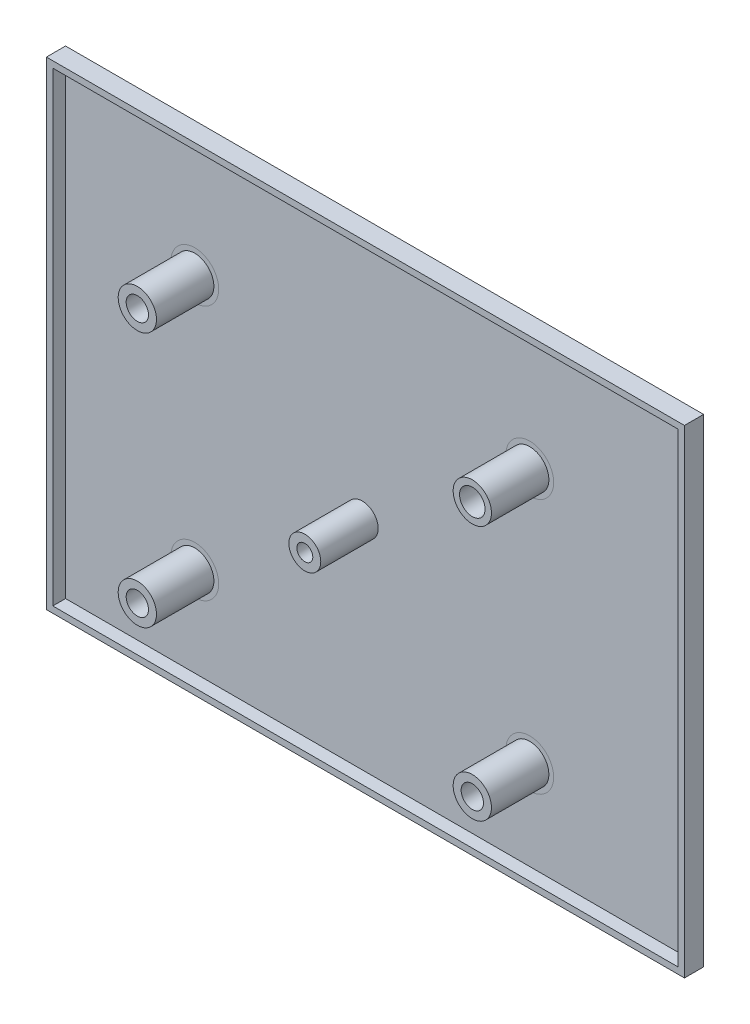
ISO-10303-21;
HEADER;
FILE_DESCRIPTION(('STEP AP214'),'2;1');
FILE_NAME('part.step','',(''),(''),'','','');
FILE_SCHEMA(('AUTOMOTIVE_DESIGN { 1 0 10303 214 1 1 1 1 }'));
ENDSEC;
DATA;
#1=APPLICATION_CONTEXT('core data for automotive mechanical design processes');
#2=APPLICATION_PROTOCOL_DEFINITION('international standard','automotive_design',2000,#1);
#3=PRODUCT_CONTEXT('',#1,'mechanical');
#4=PRODUCT('Part','Part','',(#3));
#5=PRODUCT_RELATED_PRODUCT_CATEGORY('part','',(#4));
#6=PRODUCT_DEFINITION_FORMATION('','',#4);
#7=PRODUCT_DEFINITION_CONTEXT('part definition',#1,'design');
#8=PRODUCT_DEFINITION('design','',#6,#7);
#9=PRODUCT_DEFINITION_SHAPE('','',#8);
#10=(LENGTH_UNIT() NAMED_UNIT(*) SI_UNIT(.MILLI.,.METRE.));
#11=(NAMED_UNIT(*) PLANE_ANGLE_UNIT() SI_UNIT($,.RADIAN.));
#12=(NAMED_UNIT(*) SI_UNIT($,.STERADIAN.) SOLID_ANGLE_UNIT());
#13=UNCERTAINTY_MEASURE_WITH_UNIT(LENGTH_MEASURE(1.E-05),#10,'distance_accuracy_value','');
#14=(GEOMETRIC_REPRESENTATION_CONTEXT(3) GLOBAL_UNCERTAINTY_ASSIGNED_CONTEXT((#13)) GLOBAL_UNIT_ASSIGNED_CONTEXT((#10,
#11,#12)) REPRESENTATION_CONTEXT('',''));
#15=CARTESIAN_POINT('',(0.,0.,0.));
#16=DIRECTION('',(0.,0.,1.));
#17=DIRECTION('',(1.,0.,0.));
#18=AXIS2_PLACEMENT_3D('',#15,#16,#17);
#19=CARTESIAN_POINT('',(0.,0.,2.));
#20=DIRECTION('',(0.,0.,-1.));
#21=DIRECTION('',(-1.,0.,0.));
#22=AXIS2_PLACEMENT_3D('',#19,#20,#21);
#23=PLANE('',#22);
#24=CARTESIAN_POINT('',(147.5,-120.,2.));
#25=DIRECTION('',(0.,0.,-1.));
#26=DIRECTION('',(-1.,0.,0.));
#27=AXIS2_PLACEMENT_3D('',#24,#25,#26);
#28=CIRCLE('',#27,7.50000000000001);
#29=CARTESIAN_POINT('',(140.,-120.,2.));
#30=VERTEX_POINT('',#29);
#31=EDGE_CURVE('E66',#30,#30,#28,.F.);
#32=ORIENTED_EDGE('',*,*,#31,.F.);
#33=EDGE_LOOP('',(#32));
#34=FACE_BOUND('',#33,.T.);
#35=CARTESIAN_POINT('',(42.5,-40.,2.));
#36=DIRECTION('',(0.,0.,-1.));
#37=DIRECTION('',(-1.,0.,0.));
#38=AXIS2_PLACEMENT_3D('',#35,#36,#37);
#39=CIRCLE('',#38,7.50000000000001);
#40=CARTESIAN_POINT('',(35.,-40.,2.));
#41=VERTEX_POINT('',#40);
#42=EDGE_CURVE('E187',#41,#41,#39,.F.);
#43=ORIENTED_EDGE('',*,*,#42,.F.);
#44=EDGE_LOOP('',(#43));
#45=FACE_BOUND('',#44,.T.);
#46=DIRECTION('',(0.,-1.,0.));
#47=VECTOR('',#46,1.);
#48=CARTESIAN_POINT('',(2.,-2.,2.));
#49=LINE('',#48,#47);
#50=CARTESIAN_POINT('',(2.,-2.,2.));
#51=VERTEX_POINT('',#50);
#52=CARTESIAN_POINT('',(2.,-148.,2.));
#53=VERTEX_POINT('',#52);
#54=EDGE_CURVE('E134',#51,#53,#49,.T.);
#55=ORIENTED_EDGE('',*,*,#54,.T.);
#56=DIRECTION('',(1.,0.,0.));
#57=VECTOR('',#56,1.);
#58=CARTESIAN_POINT('',(2.,-148.,2.));
#59=LINE('',#58,#57);
#60=CARTESIAN_POINT('',(198.,-148.,2.));
#61=VERTEX_POINT('',#60);
#62=EDGE_CURVE('E154',#53,#61,#59,.T.);
#63=ORIENTED_EDGE('',*,*,#62,.T.);
#64=DIRECTION('',(0.,1.,0.));
#65=VECTOR('',#64,1.);
#66=CARTESIAN_POINT('',(198.,-148.,2.));
#67=LINE('',#66,#65);
#68=CARTESIAN_POINT('',(198.,-2.,2.));
#69=VERTEX_POINT('',#68);
#70=EDGE_CURVE('E140',#61,#69,#67,.T.);
#71=ORIENTED_EDGE('',*,*,#70,.T.);
#72=DIRECTION('',(-1.,0.,0.));
#73=VECTOR('',#72,1.);
#74=CARTESIAN_POINT('',(198.,-2.,2.));
#75=LINE('',#74,#73);
#76=EDGE_CURVE('E158',#69,#51,#75,.T.);
#77=ORIENTED_EDGE('',*,*,#76,.T.);
#78=EDGE_LOOP('',(#55,#63,#71,#77));
#79=FACE_BOUND('',#78,.T.);
#80=CARTESIAN_POINT('',(95.,-80.,2.));
#81=DIRECTION('',(0.,0.,-1.));
#82=DIRECTION('',(-1.,0.,0.));
#83=AXIS2_PLACEMENT_3D('',#80,#81,#82);
#84=CIRCLE('',#83,5.00000000000001);
#85=CARTESIAN_POINT('',(90.,-80.,2.));
#86=VERTEX_POINT('',#85);
#87=EDGE_CURVE('E196',#86,#86,#84,.F.);
#88=ORIENTED_EDGE('',*,*,#87,.F.);
#89=EDGE_LOOP('',(#88));
#90=FACE_BOUND('',#89,.T.);
#91=CARTESIAN_POINT('',(147.5,-40.,2.));
#92=DIRECTION('',(0.,0.,-1.));
#93=DIRECTION('',(-1.,0.,0.));
#94=AXIS2_PLACEMENT_3D('',#91,#92,#93);
#95=CIRCLE('',#94,7.50000000000001);
#96=CARTESIAN_POINT('',(140.,-40.,2.));
#97=VERTEX_POINT('',#96);
#98=EDGE_CURVE('E248',#97,#97,#95,.F.);
#99=ORIENTED_EDGE('',*,*,#98,.F.);
#100=EDGE_LOOP('',(#99));
#101=FACE_BOUND('',#100,.T.);
#102=CARTESIAN_POINT('',(42.5,-120.,2.));
#103=DIRECTION('',(0.,0.,-1.));
#104=DIRECTION('',(-1.,0.,0.));
#105=AXIS2_PLACEMENT_3D('',#102,#103,#104);
#106=CIRCLE('',#105,7.50000000000001);
#107=CARTESIAN_POINT('',(35.,-120.,2.));
#108=VERTEX_POINT('',#107);
#109=EDGE_CURVE('E12',#108,#108,#106,.F.);
#110=ORIENTED_EDGE('',*,*,#109,.F.);
#111=EDGE_LOOP('',(#110));
#112=FACE_BOUND('',#111,.T.);
#113=ADVANCED_FACE('F57',(#34,#45,#79,#90,#101,#112),#23,.F.);
#114=ORIENTED_EDGE('',*,*,#109,.T.);
#115=EDGE_LOOP('',(#114));
#116=FACE_BOUND('',#115,.T.);
#117=CARTESIAN_POINT('',(42.5,-120.,2.));
#118=DIRECTION('',(0.,0.,-1.));
#119=DIRECTION('',(-1.,0.,0.));
#120=AXIS2_PLACEMENT_3D('',#117,#118,#119);
#121=CIRCLE('',#120,6.00000000000001);
#122=CARTESIAN_POINT('',(36.5,-120.,2.));
#123=VERTEX_POINT('',#122);
#124=EDGE_CURVE('E188',#123,#123,#121,.F.);
#125=ORIENTED_EDGE('',*,*,#124,.F.);
#126=EDGE_LOOP('',(#125));
#127=FACE_BOUND('',#126,.T.);
#128=ADVANCED_FACE('F262',(#116,#127),#23,.F.);
#129=ORIENTED_EDGE('',*,*,#31,.T.);
#130=EDGE_LOOP('',(#129));
#131=FACE_BOUND('',#130,.T.);
#132=CARTESIAN_POINT('',(147.5,-120.,2.));
#133=DIRECTION('',(0.,0.,-1.));
#134=DIRECTION('',(-1.,0.,0.));
#135=AXIS2_PLACEMENT_3D('',#132,#133,#134);
#136=CIRCLE('',#135,6.00000000000002);
#137=CARTESIAN_POINT('',(141.5,-120.,2.));
#138=VERTEX_POINT('',#137);
#139=EDGE_CURVE('E183',#138,#138,#136,.F.);
#140=ORIENTED_EDGE('',*,*,#139,.F.);
#141=EDGE_LOOP('',(#140));
#142=FACE_BOUND('',#141,.T.);
#143=ADVANCED_FACE('F257',(#131,#142),#23,.F.);
#144=ORIENTED_EDGE('',*,*,#98,.T.);
#145=EDGE_LOOP('',(#144));
#146=FACE_BOUND('',#145,.T.);
#147=CARTESIAN_POINT('',(147.5,-40.,2.));
#148=DIRECTION('',(0.,0.,-1.));
#149=DIRECTION('',(-1.,0.,0.));
#150=AXIS2_PLACEMENT_3D('',#147,#148,#149);
#151=CIRCLE('',#150,6.00000000000002);
#152=CARTESIAN_POINT('',(141.5,-40.,2.));
#153=VERTEX_POINT('',#152);
#154=EDGE_CURVE('E204',#153,#153,#151,.F.);
#155=ORIENTED_EDGE('',*,*,#154,.F.);
#156=EDGE_LOOP('',(#155));
#157=FACE_BOUND('',#156,.T.);
#158=ADVANCED_FACE('F319',(#146,#157),#23,.F.);
#159=ORIENTED_EDGE('',*,*,#42,.T.);
#160=EDGE_LOOP('',(#159));
#161=FACE_BOUND('',#160,.T.);
#162=CARTESIAN_POINT('',(42.5,-40.,2.));
#163=DIRECTION('',(0.,0.,-1.));
#164=DIRECTION('',(-1.,0.,0.));
#165=AXIS2_PLACEMENT_3D('',#162,#163,#164);
#166=CIRCLE('',#165,6.00000000000001);
#167=CARTESIAN_POINT('',(36.5,-40.,2.));
#168=VERTEX_POINT('',#167);
#169=EDGE_CURVE('E212',#168,#168,#166,.F.);
#170=ORIENTED_EDGE('',*,*,#169,.F.);
#171=EDGE_LOOP('',(#170));
#172=FACE_BOUND('',#171,.T.);
#173=ADVANCED_FACE('F264',(#161,#172),#23,.F.);
#174=CARTESIAN_POINT('',(42.5,-40.,20.));
#175=DIRECTION('',(0.,0.,-1.));
#176=DIRECTION('',(-1.,0.,0.));
#177=AXIS2_PLACEMENT_3D('',#174,#175,#176);
#178=CYLINDRICAL_SURFACE('',#177,6.00000000000001);
#179=CARTESIAN_POINT('',(42.5,-40.,20.));
#180=DIRECTION('',(0.,0.,1.));
#181=DIRECTION('',(1.,0.,0.));
#182=AXIS2_PLACEMENT_3D('',#179,#180,#181);
#183=CIRCLE('',#182,6.00000000000001);
#184=CARTESIAN_POINT('',(48.5,-40.,20.));
#185=VERTEX_POINT('',#184);
#186=EDGE_CURVE('E208',#185,#185,#183,.T.);
#187=ORIENTED_EDGE('',*,*,#186,.F.);
#188=EDGE_LOOP('',(#187));
#189=FACE_BOUND('',#188,.T.);
#190=ORIENTED_EDGE('',*,*,#169,.T.);
#191=EDGE_LOOP('',(#190));
#192=FACE_BOUND('',#191,.T.);
#193=ADVANCED_FACE('F313',(#189,#192),#178,.T.);
#194=CARTESIAN_POINT('',(42.5,-40.,20.));
#195=DIRECTION('',(0.,0.,1.));
#196=DIRECTION('',(1.,0.,0.));
#197=AXIS2_PLACEMENT_3D('',#194,#195,#196);
#198=PLANE('',#197);
#199=CARTESIAN_POINT('',(42.5,-40.,20.));
#200=DIRECTION('',(0.,0.,1.));
#201=DIRECTION('',(1.,0.,0.));
#202=AXIS2_PLACEMENT_3D('',#199,#200,#201);
#203=CIRCLE('',#202,3.5);
#204=CARTESIAN_POINT('',(46.,-40.,20.));
#205=VERTEX_POINT('',#204);
#206=EDGE_CURVE('E616',#205,#205,#203,.T.);
#207=ORIENTED_EDGE('',*,*,#206,.F.);
#208=EDGE_LOOP('',(#207));
#209=FACE_BOUND('',#208,.T.);
#210=ORIENTED_EDGE('',*,*,#186,.T.);
#211=EDGE_LOOP('',(#210));
#212=FACE_BOUND('',#211,.T.);
#213=ADVANCED_FACE('F306',(#209,#212),#198,.T.);
#214=CARTESIAN_POINT('',(147.5,-40.,20.));
#215=DIRECTION('',(0.,0.,-1.));
#216=DIRECTION('',(-1.,0.,0.));
#217=AXIS2_PLACEMENT_3D('',#214,#215,#216);
#218=CYLINDRICAL_SURFACE('',#217,6.00000000000002);
#219=CARTESIAN_POINT('',(147.5,-40.,20.));
#220=DIRECTION('',(0.,0.,1.));
#221=DIRECTION('',(1.,0.,0.));
#222=AXIS2_PLACEMENT_3D('',#219,#220,#221);
#223=CIRCLE('',#222,6.00000000000002);
#224=CARTESIAN_POINT('',(153.5,-40.,20.));
#225=VERTEX_POINT('',#224);
#226=EDGE_CURVE('E200',#225,#225,#223,.T.);
#227=ORIENTED_EDGE('',*,*,#226,.F.);
#228=EDGE_LOOP('',(#227));
#229=FACE_BOUND('',#228,.T.);
#230=ORIENTED_EDGE('',*,*,#154,.T.);
#231=EDGE_LOOP('',(#230));
#232=FACE_BOUND('',#231,.T.);
#233=ADVANCED_FACE('F303',(#229,#232),#218,.T.);
#234=CARTESIAN_POINT('',(147.5,-40.,20.));
#235=DIRECTION('',(0.,0.,1.));
#236=DIRECTION('',(1.,0.,0.));
#237=AXIS2_PLACEMENT_3D('',#234,#235,#236);
#238=PLANE('',#237);
#239=CARTESIAN_POINT('',(147.5,-40.,20.));
#240=DIRECTION('',(0.,0.,1.));
#241=DIRECTION('',(1.,0.,0.));
#242=AXIS2_PLACEMENT_3D('',#239,#240,#241);
#243=CIRCLE('',#242,3.99999999999999);
#244=CARTESIAN_POINT('',(151.5,-40.,20.));
#245=VERTEX_POINT('',#244);
#246=EDGE_CURVE('E622',#245,#245,#243,.T.);
#247=ORIENTED_EDGE('',*,*,#246,.F.);
#248=EDGE_LOOP('',(#247));
#249=FACE_BOUND('',#248,.T.);
#250=ORIENTED_EDGE('',*,*,#226,.T.);
#251=EDGE_LOOP('',(#250));
#252=FACE_BOUND('',#251,.T.);
#253=ADVANCED_FACE('F300',(#249,#252),#238,.T.);
#254=CARTESIAN_POINT('',(95.,-80.,20.));
#255=DIRECTION('',(0.,0.,-1.));
#256=DIRECTION('',(-1.,0.,0.));
#257=AXIS2_PLACEMENT_3D('',#254,#255,#256);
#258=CYLINDRICAL_SURFACE('',#257,5.00000000000001);
#259=CARTESIAN_POINT('',(95.,-80.,20.));
#260=DIRECTION('',(0.,0.,1.));
#261=DIRECTION('',(1.,0.,0.));
#262=AXIS2_PLACEMENT_3D('',#259,#260,#261);
#263=CIRCLE('',#262,5.00000000000001);
#264=CARTESIAN_POINT('',(100.,-80.,20.));
#265=VERTEX_POINT('',#264);
#266=EDGE_CURVE('E192',#265,#265,#263,.T.);
#267=ORIENTED_EDGE('',*,*,#266,.F.);
#268=EDGE_LOOP('',(#267));
#269=FACE_BOUND('',#268,.T.);
#270=ORIENTED_EDGE('',*,*,#87,.T.);
#271=EDGE_LOOP('',(#270));
#272=FACE_BOUND('',#271,.T.);
#273=ADVANCED_FACE('F291',(#269,#272),#258,.T.);
#274=CARTESIAN_POINT('',(95.,-80.,20.));
#275=DIRECTION('',(0.,0.,1.));
#276=DIRECTION('',(1.,0.,0.));
#277=AXIS2_PLACEMENT_3D('',#274,#275,#276);
#278=PLANE('',#277);
#279=CARTESIAN_POINT('',(95.,-80.,20.));
#280=DIRECTION('',(0.,0.,1.));
#281=DIRECTION('',(1.,0.,0.));
#282=AXIS2_PLACEMENT_3D('',#279,#280,#281);
#283=CIRCLE('',#282,2.50000000000001);
#284=CARTESIAN_POINT('',(97.5,-80.,20.));
#285=VERTEX_POINT('',#284);
#286=EDGE_CURVE('E642',#285,#285,#283,.T.);
#287=ORIENTED_EDGE('',*,*,#286,.F.);
#288=EDGE_LOOP('',(#287));
#289=FACE_BOUND('',#288,.T.);
#290=ORIENTED_EDGE('',*,*,#266,.T.);
#291=EDGE_LOOP('',(#290));
#292=FACE_BOUND('',#291,.T.);
#293=ADVANCED_FACE('F281',(#289,#292),#278,.T.);
#294=CARTESIAN_POINT('',(42.5,-120.,20.));
#295=DIRECTION('',(0.,0.,-1.));
#296=DIRECTION('',(-1.,0.,0.));
#297=AXIS2_PLACEMENT_3D('',#294,#295,#296);
#298=CYLINDRICAL_SURFACE('',#297,6.00000000000001);
#299=CARTESIAN_POINT('',(42.5,-120.,20.));
#300=DIRECTION('',(0.,0.,1.));
#301=DIRECTION('',(1.,0.,0.));
#302=AXIS2_PLACEMENT_3D('',#299,#300,#301);
#303=CIRCLE('',#302,6.00000000000001);
#304=CARTESIAN_POINT('',(48.5,-120.,20.));
#305=VERTEX_POINT('',#304);
#306=EDGE_CURVE('E182',#305,#305,#303,.T.);
#307=ORIENTED_EDGE('',*,*,#306,.F.);
#308=EDGE_LOOP('',(#307));
#309=FACE_BOUND('',#308,.T.);
#310=ORIENTED_EDGE('',*,*,#124,.T.);
#311=EDGE_LOOP('',(#310));
#312=FACE_BOUND('',#311,.T.);
#313=ADVANCED_FACE('F278',(#309,#312),#298,.T.);
#314=CARTESIAN_POINT('',(42.5,-120.,20.));
#315=DIRECTION('',(0.,0.,1.));
#316=DIRECTION('',(1.,0.,0.));
#317=AXIS2_PLACEMENT_3D('',#314,#315,#316);
#318=PLANE('',#317);
#319=CARTESIAN_POINT('',(42.5,-120.,20.));
#320=DIRECTION('',(0.,0.,1.));
#321=DIRECTION('',(1.,0.,0.));
#322=AXIS2_PLACEMENT_3D('',#319,#320,#321);
#323=CIRCLE('',#322,3.5);
#324=CARTESIAN_POINT('',(46.,-120.,20.));
#325=VERTEX_POINT('',#324);
#326=EDGE_CURVE('E601',#325,#325,#323,.T.);
#327=ORIENTED_EDGE('',*,*,#326,.F.);
#328=EDGE_LOOP('',(#327));
#329=FACE_BOUND('',#328,.T.);
#330=ORIENTED_EDGE('',*,*,#306,.T.);
#331=EDGE_LOOP('',(#330));
#332=FACE_BOUND('',#331,.T.);
#333=ADVANCED_FACE('F280',(#329,#332),#318,.T.);
#334=CARTESIAN_POINT('',(147.5,-120.,20.));
#335=DIRECTION('',(0.,0.,-1.));
#336=DIRECTION('',(-1.,0.,0.));
#337=AXIS2_PLACEMENT_3D('',#334,#335,#336);
#338=CYLINDRICAL_SURFACE('',#337,6.00000000000002);
#339=CARTESIAN_POINT('',(147.5,-120.,20.));
#340=DIRECTION('',(0.,0.,1.));
#341=DIRECTION('',(1.,0.,0.));
#342=AXIS2_PLACEMENT_3D('',#339,#340,#341);
#343=CIRCLE('',#342,6.00000000000002);
#344=CARTESIAN_POINT('',(153.5,-120.,20.));
#345=VERTEX_POINT('',#344);
#346=EDGE_CURVE('E178',#345,#345,#343,.T.);
#347=ORIENTED_EDGE('',*,*,#346,.F.);
#348=EDGE_LOOP('',(#347));
#349=FACE_BOUND('',#348,.T.);
#350=ORIENTED_EDGE('',*,*,#139,.T.);
#351=EDGE_LOOP('',(#350));
#352=FACE_BOUND('',#351,.T.);
#353=ADVANCED_FACE('F288',(#349,#352),#338,.T.);
#354=CARTESIAN_POINT('',(147.5,-120.,20.));
#355=DIRECTION('',(0.,0.,1.));
#356=DIRECTION('',(1.,0.,0.));
#357=AXIS2_PLACEMENT_3D('',#354,#355,#356);
#358=PLANE('',#357);
#359=CARTESIAN_POINT('',(147.5,-120.,20.));
#360=DIRECTION('',(0.,0.,1.));
#361=DIRECTION('',(1.,0.,0.));
#362=AXIS2_PLACEMENT_3D('',#359,#360,#361);
#363=CIRCLE('',#362,3.49999999999999);
#364=CARTESIAN_POINT('',(151.,-120.,20.));
#365=VERTEX_POINT('',#364);
#366=EDGE_CURVE('E605',#365,#365,#363,.T.);
#367=ORIENTED_EDGE('',*,*,#366,.F.);
#368=EDGE_LOOP('',(#367));
#369=FACE_BOUND('',#368,.T.);
#370=ORIENTED_EDGE('',*,*,#346,.T.);
#371=EDGE_LOOP('',(#370));
#372=FACE_BOUND('',#371,.T.);
#373=ADVANCED_FACE('F296',(#369,#372),#358,.T.);
#374=CARTESIAN_POINT('',(0.,0.,6.));
#375=DIRECTION('',(0.,0.,1.));
#376=DIRECTION('',(1.,0.,0.));
#377=AXIS2_PLACEMENT_3D('',#374,#375,#376);
#378=PLANE('',#377);
#379=DIRECTION('',(0.,1.,0.));
#380=VECTOR('',#379,1.);
#381=CARTESIAN_POINT('',(200.,-150.,6.));
#382=LINE('',#381,#380);
#383=CARTESIAN_POINT('',(200.,-150.,6.));
#384=VERTEX_POINT('',#383);
#385=CARTESIAN_POINT('',(200.,0.,6.));
#386=VERTEX_POINT('',#385);
#387=EDGE_CURVE('E141',#384,#386,#382,.T.);
#388=ORIENTED_EDGE('',*,*,#387,.T.);
#389=DIRECTION('',(-1.,0.,0.));
#390=VECTOR('',#389,1.);
#391=CARTESIAN_POINT('',(200.,0.,6.));
#392=LINE('',#391,#390);
#393=CARTESIAN_POINT('',(0.,0.,6.));
#394=VERTEX_POINT('',#393);
#395=EDGE_CURVE('E169',#386,#394,#392,.T.);
#396=ORIENTED_EDGE('',*,*,#395,.T.);
#397=DIRECTION('',(0.,-1.,0.));
#398=VECTOR('',#397,1.);
#399=CARTESIAN_POINT('',(0.,0.,6.));
#400=LINE('',#399,#398);
#401=CARTESIAN_POINT('',(0.,-150.,6.));
#402=VERTEX_POINT('',#401);
#403=EDGE_CURVE('E172',#394,#402,#400,.T.);
#404=ORIENTED_EDGE('',*,*,#403,.T.);
#405=DIRECTION('',(1.,0.,0.));
#406=VECTOR('',#405,1.);
#407=CARTESIAN_POINT('',(0.,-150.,6.));
#408=LINE('',#407,#406);
#409=EDGE_CURVE('E175',#402,#384,#408,.T.);
#410=ORIENTED_EDGE('',*,*,#409,.T.);
#411=EDGE_LOOP('',(#388,#396,#404,#410));
#412=FACE_BOUND('',#411,.T.);
#413=DIRECTION('',(0.,1.,0.));
#414=VECTOR('',#413,1.);
#415=CARTESIAN_POINT('',(198.,-148.,6.));
#416=LINE('',#415,#414);
#417=CARTESIAN_POINT('',(198.,-148.,6.));
#418=VERTEX_POINT('',#417);
#419=CARTESIAN_POINT('',(198.,-2.,6.));
#420=VERTEX_POINT('',#419);
#421=EDGE_CURVE('E133',#418,#420,#416,.T.);
#422=ORIENTED_EDGE('',*,*,#421,.F.);
#423=DIRECTION('',(1.,0.,0.));
#424=VECTOR('',#423,1.);
#425=CARTESIAN_POINT('',(2.,-148.,6.));
#426=LINE('',#425,#424);
#427=CARTESIAN_POINT('',(2.,-148.,6.));
#428=VERTEX_POINT('',#427);
#429=EDGE_CURVE('E125',#428,#418,#426,.T.);
#430=ORIENTED_EDGE('',*,*,#429,.F.);
#431=DIRECTION('',(0.,-1.,0.));
#432=VECTOR('',#431,1.);
#433=CARTESIAN_POINT('',(2.,-2.,6.));
#434=LINE('',#433,#432);
#435=CARTESIAN_POINT('',(2.,-2.,6.));
#436=VERTEX_POINT('',#435);
#437=EDGE_CURVE('E149',#436,#428,#434,.T.);
#438=ORIENTED_EDGE('',*,*,#437,.F.);
#439=DIRECTION('',(-1.,0.,0.));
#440=VECTOR('',#439,1.);
#441=CARTESIAN_POINT('',(198.,-2.,6.));
#442=LINE('',#441,#440);
#443=EDGE_CURVE('E147',#420,#436,#442,.T.);
#444=ORIENTED_EDGE('',*,*,#443,.F.);
#445=EDGE_LOOP('',(#422,#430,#438,#444));
#446=FACE_BOUND('',#445,.T.);
#447=ADVANCED_FACE('F145',(#412,#446),#378,.T.);
#448=CARTESIAN_POINT('',(2.,-148.,6.));
#449=DIRECTION('',(0.,1.,0.));
#450=DIRECTION('',(0.,0.,1.));
#451=AXIS2_PLACEMENT_3D('',#448,#449,#450);
#452=PLANE('',#451);
#453=ORIENTED_EDGE('',*,*,#62,.F.);
#454=DIRECTION('',(0.,0.,-1.));
#455=VECTOR('',#454,1.);
#456=CARTESIAN_POINT('',(2.,-148.,6.));
#457=LINE('',#456,#455);
#458=EDGE_CURVE('E73',#428,#53,#457,.T.);
#459=ORIENTED_EDGE('',*,*,#458,.F.);
#460=ORIENTED_EDGE('',*,*,#429,.T.);
#461=DIRECTION('',(0.,0.,-1.));
#462=VECTOR('',#461,1.);
#463=CARTESIAN_POINT('',(198.,-148.,6.));
#464=LINE('',#463,#462);
#465=EDGE_CURVE('E128',#418,#61,#464,.T.);
#466=ORIENTED_EDGE('',*,*,#465,.T.);
#467=EDGE_LOOP('',(#453,#459,#460,#466));
#468=FACE_BOUND('',#467,.T.);
#469=ADVANCED_FACE('F127',(#468),#452,.T.);
#470=CARTESIAN_POINT('',(198.,-148.,6.));
#471=DIRECTION('',(-1.,0.,0.));
#472=DIRECTION('',(0.,0.,1.));
#473=AXIS2_PLACEMENT_3D('',#470,#471,#472);
#474=PLANE('',#473);
#475=ORIENTED_EDGE('',*,*,#70,.F.);
#476=ORIENTED_EDGE('',*,*,#465,.F.);
#477=ORIENTED_EDGE('',*,*,#421,.T.);
#478=DIRECTION('',(0.,0.,-1.));
#479=VECTOR('',#478,1.);
#480=CARTESIAN_POINT('',(198.,-2.,6.));
#481=LINE('',#480,#479);
#482=EDGE_CURVE('E142',#420,#69,#481,.T.);
#483=ORIENTED_EDGE('',*,*,#482,.T.);
#484=EDGE_LOOP('',(#475,#476,#477,#483));
#485=FACE_BOUND('',#484,.T.);
#486=ADVANCED_FACE('F137',(#485),#474,.T.);
#487=CARTESIAN_POINT('',(198.,-2.,6.));
#488=DIRECTION('',(0.,-1.,0.));
#489=DIRECTION('',(0.,0.,-1.));
#490=AXIS2_PLACEMENT_3D('',#487,#488,#489);
#491=PLANE('',#490);
#492=ORIENTED_EDGE('',*,*,#76,.F.);
#493=ORIENTED_EDGE('',*,*,#482,.F.);
#494=ORIENTED_EDGE('',*,*,#443,.T.);
#495=DIRECTION('',(0.,0.,-1.));
#496=VECTOR('',#495,1.);
#497=CARTESIAN_POINT('',(2.,-2.,6.));
#498=LINE('',#497,#496);
#499=EDGE_CURVE('E164',#436,#51,#498,.T.);
#500=ORIENTED_EDGE('',*,*,#499,.T.);
#501=EDGE_LOOP('',(#492,#493,#494,#500));
#502=FACE_BOUND('',#501,.T.);
#503=ADVANCED_FACE('F498',(#502),#491,.T.);
#504=CARTESIAN_POINT('',(2.,-2.,6.));
#505=DIRECTION('',(1.,0.,0.));
#506=DIRECTION('',(0.,0.,-1.));
#507=AXIS2_PLACEMENT_3D('',#504,#505,#506);
#508=PLANE('',#507);
#509=ORIENTED_EDGE('',*,*,#54,.F.);
#510=ORIENTED_EDGE('',*,*,#499,.F.);
#511=ORIENTED_EDGE('',*,*,#437,.T.);
#512=ORIENTED_EDGE('',*,*,#458,.T.);
#513=EDGE_LOOP('',(#509,#510,#511,#512));
#514=FACE_BOUND('',#513,.T.);
#515=ADVANCED_FACE('F325',(#514),#508,.T.);
#516=CARTESIAN_POINT('',(0.,0.,0.));
#517=DIRECTION('',(0.,0.,-1.));
#518=DIRECTION('',(-1.,0.,0.));
#519=AXIS2_PLACEMENT_3D('',#516,#517,#518);
#520=PLANE('',#519);
#521=DIRECTION('',(0.,-1.,0.));
#522=VECTOR('',#521,1.);
#523=CARTESIAN_POINT('',(0.,-150.,0.));
#524=LINE('',#523,#522);
#525=CARTESIAN_POINT('',(0.,0.,0.));
#526=VERTEX_POINT('',#525);
#527=CARTESIAN_POINT('',(0.,-150.,0.));
#528=VERTEX_POINT('',#527);
#529=EDGE_CURVE('E216',#526,#528,#524,.T.);
#530=ORIENTED_EDGE('',*,*,#529,.F.);
#531=DIRECTION('',(-1.,0.,0.));
#532=VECTOR('',#531,1.);
#533=CARTESIAN_POINT('',(0.,0.,0.));
#534=LINE('',#533,#532);
#535=CARTESIAN_POINT('',(200.,0.,0.));
#536=VERTEX_POINT('',#535);
#537=EDGE_CURVE('E81',#536,#526,#534,.T.);
#538=ORIENTED_EDGE('',*,*,#537,.F.);
#539=DIRECTION('',(0.,1.,0.));
#540=VECTOR('',#539,1.);
#541=CARTESIAN_POINT('',(200.,0.,0.));
#542=LINE('',#541,#540);
#543=CARTESIAN_POINT('',(200.,-150.,0.));
#544=VERTEX_POINT('',#543);
#545=EDGE_CURVE('E227',#544,#536,#542,.T.);
#546=ORIENTED_EDGE('',*,*,#545,.F.);
#547=DIRECTION('',(1.,0.,0.));
#548=VECTOR('',#547,1.);
#549=CARTESIAN_POINT('',(200.,-150.,0.));
#550=LINE('',#549,#548);
#551=EDGE_CURVE('E224',#528,#544,#550,.T.);
#552=ORIENTED_EDGE('',*,*,#551,.F.);
#553=EDGE_LOOP('',(#530,#538,#546,#552));
#554=FACE_BOUND('',#553,.T.);
#555=ADVANCED_FACE('F321',(#554),#520,.T.);
#556=CARTESIAN_POINT('',(200.,-150.,2.));
#557=DIRECTION('',(0.,1.,0.));
#558=DIRECTION('',(-1.,0.,0.));
#559=AXIS2_PLACEMENT_3D('',#556,#557,#558);
#560=PLANE('',#559);
#561=ORIENTED_EDGE('',*,*,#551,.T.);
#562=DIRECTION('',(0.,0.,-1.));
#563=VECTOR('',#562,1.);
#564=CARTESIAN_POINT('',(200.,-150.,2.));
#565=LINE('',#564,#563);
#566=EDGE_CURVE('E238',#384,#544,#565,.T.);
#567=ORIENTED_EDGE('',*,*,#566,.F.);
#568=ORIENTED_EDGE('',*,*,#409,.F.);
#569=DIRECTION('',(0.,0.,-1.));
#570=VECTOR('',#569,1.);
#571=CARTESIAN_POINT('',(0.,-150.,2.));
#572=LINE('',#571,#570);
#573=EDGE_CURVE('E220',#402,#528,#572,.T.);
#574=ORIENTED_EDGE('',*,*,#573,.T.);
#575=EDGE_LOOP('',(#561,#567,#568,#574));
#576=FACE_BOUND('',#575,.T.);
#577=ADVANCED_FACE('F324',(#576),#560,.F.);
#578=CARTESIAN_POINT('',(0.,-150.,2.));
#579=DIRECTION('',(1.,0.,0.));
#580=DIRECTION('',(0.,0.,-1.));
#581=AXIS2_PLACEMENT_3D('',#578,#579,#580);
#582=PLANE('',#581);
#583=ORIENTED_EDGE('',*,*,#529,.T.);
#584=ORIENTED_EDGE('',*,*,#573,.F.);
#585=ORIENTED_EDGE('',*,*,#403,.F.);
#586=DIRECTION('',(0.,0.,-1.));
#587=VECTOR('',#586,1.);
#588=CARTESIAN_POINT('',(0.,0.,2.));
#589=LINE('',#588,#587);
#590=EDGE_CURVE('E232',#394,#526,#589,.T.);
#591=ORIENTED_EDGE('',*,*,#590,.T.);
#592=EDGE_LOOP('',(#583,#584,#585,#591));
#593=FACE_BOUND('',#592,.T.);
#594=ADVANCED_FACE('F59',(#593),#582,.F.);
#595=CARTESIAN_POINT('',(0.,0.,2.));
#596=DIRECTION('',(0.,-1.,0.));
#597=DIRECTION('',(0.,0.,-1.));
#598=AXIS2_PLACEMENT_3D('',#595,#596,#597);
#599=PLANE('',#598);
#600=ORIENTED_EDGE('',*,*,#537,.T.);
#601=ORIENTED_EDGE('',*,*,#590,.F.);
#602=ORIENTED_EDGE('',*,*,#395,.F.);
#603=DIRECTION('',(0.,0.,-1.));
#604=VECTOR('',#603,1.);
#605=CARTESIAN_POINT('',(200.,0.,2.));
#606=LINE('',#605,#604);
#607=EDGE_CURVE('E235',#386,#536,#606,.T.);
#608=ORIENTED_EDGE('',*,*,#607,.T.);
#609=EDGE_LOOP('',(#600,#601,#602,#608));
#610=FACE_BOUND('',#609,.T.);
#611=ADVANCED_FACE('F327',(#610),#599,.F.);
#612=CARTESIAN_POINT('',(200.,0.,2.));
#613=DIRECTION('',(-1.,0.,0.));
#614=DIRECTION('',(0.,-1.,0.));
#615=AXIS2_PLACEMENT_3D('',#612,#613,#614);
#616=PLANE('',#615);
#617=ORIENTED_EDGE('',*,*,#545,.T.);
#618=ORIENTED_EDGE('',*,*,#607,.F.);
#619=ORIENTED_EDGE('',*,*,#387,.F.);
#620=ORIENTED_EDGE('',*,*,#566,.T.);
#621=EDGE_LOOP('',(#617,#618,#619,#620));
#622=FACE_BOUND('',#621,.T.);
#623=ADVANCED_FACE('F330',(#622),#616,.F.);
#624=CARTESIAN_POINT('',(0.,0.,2.));
#625=DIRECTION('',(0.,0.,-1.));
#626=DIRECTION('',(-1.,0.,0.));
#627=AXIS2_PLACEMENT_3D('',#624,#625,#626);
#628=PLANE('',#627);
#629=CARTESIAN_POINT('',(147.5,-40.,2.));
#630=DIRECTION('',(0.,0.,-1.));
#631=DIRECTION('',(-1.,0.,0.));
#632=AXIS2_PLACEMENT_3D('',#629,#630,#631);
#633=CIRCLE('',#632,3.99999999999999);
#634=CARTESIAN_POINT('',(143.5,-40.,2.));
#635=VERTEX_POINT('',#634);
#636=EDGE_CURVE('E156',#635,#635,#633,.F.);
#637=ORIENTED_EDGE('',*,*,#636,.T.);
#638=EDGE_LOOP('',(#637));
#639=FACE_BOUND('',#638,.T.);
#640=ADVANCED_FACE('F332',(#639),#628,.F.);
#641=CARTESIAN_POINT('',(147.5,-40.,-9.31370849898475));
#642=DIRECTION('',(0.,0.,1.));
#643=DIRECTION('',(1.,0.,0.));
#644=AXIS2_PLACEMENT_3D('',#641,#642,#643);
#645=CYLINDRICAL_SURFACE('',#644,3.99999999999999);
#646=ORIENTED_EDGE('',*,*,#246,.T.);
#647=EDGE_LOOP('',(#646));
#648=FACE_BOUND('',#647,.T.);
#649=ORIENTED_EDGE('',*,*,#636,.F.);
#650=EDGE_LOOP('',(#649));
#651=FACE_BOUND('',#650,.T.);
#652=ADVANCED_FACE('F546',(#648,#651),#645,.F.);
#653=CARTESIAN_POINT('',(0.,0.,2.));
#654=DIRECTION('',(0.,0.,-1.));
#655=DIRECTION('',(-1.,0.,0.));
#656=AXIS2_PLACEMENT_3D('',#653,#654,#655);
#657=PLANE('',#656);
#658=CARTESIAN_POINT('',(42.5,-40.,2.));
#659=DIRECTION('',(0.,0.,-1.));
#660=DIRECTION('',(-1.,0.,0.));
#661=AXIS2_PLACEMENT_3D('',#658,#659,#660);
#662=CIRCLE('',#661,3.5);
#663=CARTESIAN_POINT('',(46.,-40.,2.));
#664=VERTEX_POINT('',#663);
#665=EDGE_CURVE('E619',#664,#664,#662,.F.);
#666=ORIENTED_EDGE('',*,*,#665,.T.);
#667=EDGE_LOOP('',(#666));
#668=FACE_BOUND('',#667,.T.);
#669=ADVANCED_FACE('F552',(#668),#657,.F.);
#670=CARTESIAN_POINT('',(42.5,-40.,-7.89949493661167));
#671=DIRECTION('',(0.,0.,1.));
#672=DIRECTION('',(1.,0.,0.));
#673=AXIS2_PLACEMENT_3D('',#670,#671,#672);
#674=CYLINDRICAL_SURFACE('',#673,3.5);
#675=CARTESIAN_POINT('',(46.,-40.,20.));
#676=CARTESIAN_POINT('',(46.,-40.,19.8125));
#677=CARTESIAN_POINT('',(46.,-40.,19.625));
#678=CARTESIAN_POINT('',(46.,-40.,19.25));
#679=CARTESIAN_POINT('',(46.,-40.,19.0625));
#680=CARTESIAN_POINT('',(46.,-40.,18.6875));
#681=CARTESIAN_POINT('',(46.,-40.,18.5));
#682=CARTESIAN_POINT('',(46.,-40.,18.125));
#683=CARTESIAN_POINT('',(46.,-40.,17.9375));
#684=CARTESIAN_POINT('',(46.,-40.,17.5625));
#685=CARTESIAN_POINT('',(46.,-40.,17.375));
#686=CARTESIAN_POINT('',(46.,-40.,17.));
#687=CARTESIAN_POINT('',(46.,-40.,16.8125));
#688=CARTESIAN_POINT('',(46.,-40.,16.4375));
#689=CARTESIAN_POINT('',(46.,-40.,16.25));
#690=CARTESIAN_POINT('',(46.,-40.,15.875));
#691=CARTESIAN_POINT('',(46.,-40.,15.6875));
#692=CARTESIAN_POINT('',(46.,-40.,15.3125));
#693=CARTESIAN_POINT('',(46.,-40.,15.125));
#694=CARTESIAN_POINT('',(46.,-40.,14.75));
#695=CARTESIAN_POINT('',(46.,-40.,14.5625));
#696=CARTESIAN_POINT('',(46.,-40.,14.1875));
#697=CARTESIAN_POINT('',(46.,-40.,14.));
#698=CARTESIAN_POINT('',(46.,-40.,13.625));
#699=CARTESIAN_POINT('',(46.,-40.,13.4375));
#700=CARTESIAN_POINT('',(46.,-40.,13.0625));
#701=CARTESIAN_POINT('',(46.,-40.,12.875));
#702=CARTESIAN_POINT('',(46.,-40.,12.5));
#703=CARTESIAN_POINT('',(46.,-40.,12.3125));
#704=CARTESIAN_POINT('',(46.,-40.,11.9375));
#705=CARTESIAN_POINT('',(46.,-40.,11.75));
#706=CARTESIAN_POINT('',(46.,-40.,11.375));
#707=CARTESIAN_POINT('',(46.,-40.,11.1875));
#708=CARTESIAN_POINT('',(46.,-40.,10.8125));
#709=CARTESIAN_POINT('',(46.,-40.,10.625));
#710=CARTESIAN_POINT('',(46.,-40.,10.25));
#711=CARTESIAN_POINT('',(46.,-40.,10.0625));
#712=CARTESIAN_POINT('',(46.,-40.,9.6875));
#713=CARTESIAN_POINT('',(46.,-40.,9.5));
#714=CARTESIAN_POINT('',(46.,-40.,9.125));
#715=CARTESIAN_POINT('',(46.,-40.,8.9375));
#716=CARTESIAN_POINT('',(46.,-40.,8.5625));
#717=CARTESIAN_POINT('',(46.,-40.,8.375));
#718=CARTESIAN_POINT('',(46.,-40.,8.));
#719=CARTESIAN_POINT('',(46.,-40.,7.8125));
#720=CARTESIAN_POINT('',(46.,-40.,7.4375));
#721=CARTESIAN_POINT('',(46.,-40.,7.25));
#722=CARTESIAN_POINT('',(46.,-40.,6.875));
#723=CARTESIAN_POINT('',(46.,-40.,6.6875));
#724=CARTESIAN_POINT('',(46.,-40.,6.3125));
#725=CARTESIAN_POINT('',(46.,-40.,6.125));
#726=CARTESIAN_POINT('',(46.,-40.,5.75));
#727=CARTESIAN_POINT('',(46.,-40.,5.5625));
#728=CARTESIAN_POINT('',(46.,-40.,5.1875));
#729=CARTESIAN_POINT('',(46.,-40.,5.));
#730=CARTESIAN_POINT('',(46.,-40.,4.625));
#731=CARTESIAN_POINT('',(46.,-40.,4.4375));
#732=CARTESIAN_POINT('',(46.,-40.,4.0625));
#733=CARTESIAN_POINT('',(46.,-40.,3.875));
#734=CARTESIAN_POINT('',(46.,-40.,3.5));
#735=CARTESIAN_POINT('',(46.,-40.,3.3125));
#736=CARTESIAN_POINT('',(46.,-40.,2.9375));
#737=CARTESIAN_POINT('',(46.,-40.,2.75));
#738=CARTESIAN_POINT('',(46.,-40.,2.375));
#739=CARTESIAN_POINT('',(46.,-40.,2.1875));
#740=CARTESIAN_POINT('',(46.,-40.,2.));
#741=B_SPLINE_CURVE_WITH_KNOTS('',3,(#675,#676,#677,#678,#679,#680,#681,#682,#683,#684,#685,
#686,#687,#688,#689,#690,#691,#692,#693,#694,#695,#696,#697,#698,#699,#700,#701,#702,#703,#704,
#705,#706,#707,#708,#709,#710,#711,#712,#713,#714,#715,#716,#717,#718,#719,#720,#721,#722,#723,
#724,#725,#726,#727,#728,#729,#730,#731,#732,#733,#734,#735,#736,#737,#738,#739,#740),
.UNSPECIFIED.,.F.,.F.,(4,2,2,2,2,2,2,2,2,2,2,2,2,2,2,2,2,2,2,2,2,2,2,2,2,2,2,2,2,2,2,2,4),(0.,
0.5625,1.125,1.6875,2.25,2.8125,3.375,3.9375,4.5,5.0625,5.625,6.1875,6.75,7.3125,7.875,8.4375,
9.,9.5625,10.125,10.6875,11.25,11.8125,12.375,12.9375,13.5,14.0625,14.625,15.1875,15.75,16.3125,
16.875,17.4375,18.),.UNSPECIFIED.);
#742=EDGE_CURVE('BSEAM559',#205,#664,#741,.T.);
#743=ORIENTED_EDGE('',*,*,#206,.T.);
#744=ORIENTED_EDGE('',*,*,#665,.F.);
#745=ORIENTED_EDGE('',*,*,#742,.T.);
#746=ORIENTED_EDGE('',*,*,#742,.F.);
#747=EDGE_LOOP('',(#743,#745,#744,#746));
#748=FACE_BOUND('',#747,.T.);
#749=ADVANCED_FACE('F559',(#748),#674,.F.);
#750=CARTESIAN_POINT('',(0.,0.,2.));
#751=DIRECTION('',(0.,0.,-1.));
#752=DIRECTION('',(-1.,0.,0.));
#753=AXIS2_PLACEMENT_3D('',#750,#751,#752);
#754=PLANE('',#753);
#755=CARTESIAN_POINT('',(147.5,-120.,2.));
#756=DIRECTION('',(0.,0.,-1.));
#757=DIRECTION('',(-1.,0.,0.));
#758=AXIS2_PLACEMENT_3D('',#755,#756,#757);
#759=CIRCLE('',#758,3.49999999999999);
#760=CARTESIAN_POINT('',(144.,-120.,2.));
#761=VERTEX_POINT('',#760);
#762=EDGE_CURVE('E608',#761,#761,#759,.F.);
#763=ORIENTED_EDGE('',*,*,#762,.T.);
#764=EDGE_LOOP('',(#763));
#765=FACE_BOUND('',#764,.T.);
#766=ADVANCED_FACE('F567',(#765),#754,.F.);
#767=CARTESIAN_POINT('',(147.5,-120.,-7.89949493661166));
#768=DIRECTION('',(0.,0.,1.));
#769=DIRECTION('',(1.,0.,0.));
#770=AXIS2_PLACEMENT_3D('',#767,#768,#769);
#771=CYLINDRICAL_SURFACE('',#770,3.49999999999999);
#772=ORIENTED_EDGE('',*,*,#366,.T.);
#773=EDGE_LOOP('',(#772));
#774=FACE_BOUND('',#773,.T.);
#775=ORIENTED_EDGE('',*,*,#762,.F.);
#776=EDGE_LOOP('',(#775));
#777=FACE_BOUND('',#776,.T.);
#778=ADVANCED_FACE('F576',(#774,#777),#771,.F.);
#779=CARTESIAN_POINT('',(0.,0.,2.));
#780=DIRECTION('',(0.,0.,-1.));
#781=DIRECTION('',(-1.,0.,0.));
#782=AXIS2_PLACEMENT_3D('',#779,#780,#781);
#783=PLANE('',#782);
#784=CARTESIAN_POINT('',(42.5,-120.,2.));
#785=DIRECTION('',(0.,0.,-1.));
#786=DIRECTION('',(-1.,0.,0.));
#787=AXIS2_PLACEMENT_3D('',#784,#785,#786);
#788=CIRCLE('',#787,3.5);
#789=CARTESIAN_POINT('',(46.,-120.,2.));
#790=VERTEX_POINT('',#789);
#791=EDGE_CURVE('E604',#790,#790,#788,.F.);
#792=ORIENTED_EDGE('',*,*,#791,.T.);
#793=EDGE_LOOP('',(#792));
#794=FACE_BOUND('',#793,.T.);
#795=ADVANCED_FACE('F584',(#794),#783,.F.);
#796=CARTESIAN_POINT('',(42.5,-120.,-7.89949493661167));
#797=DIRECTION('',(0.,0.,1.));
#798=DIRECTION('',(1.,0.,0.));
#799=AXIS2_PLACEMENT_3D('',#796,#797,#798);
#800=CYLINDRICAL_SURFACE('',#799,3.5);
#801=CARTESIAN_POINT('',(46.,-120.,20.));
#802=CARTESIAN_POINT('',(46.,-120.,19.8125));
#803=CARTESIAN_POINT('',(46.,-120.,19.625));
#804=CARTESIAN_POINT('',(46.,-120.,19.25));
#805=CARTESIAN_POINT('',(46.,-120.,19.0625));
#806=CARTESIAN_POINT('',(46.,-120.,18.6875));
#807=CARTESIAN_POINT('',(46.,-120.,18.5));
#808=CARTESIAN_POINT('',(46.,-120.,18.125));
#809=CARTESIAN_POINT('',(46.,-120.,17.9375));
#810=CARTESIAN_POINT('',(46.,-120.,17.5625));
#811=CARTESIAN_POINT('',(46.,-120.,17.375));
#812=CARTESIAN_POINT('',(46.,-120.,17.));
#813=CARTESIAN_POINT('',(46.,-120.,16.8125));
#814=CARTESIAN_POINT('',(46.,-120.,16.4375));
#815=CARTESIAN_POINT('',(46.,-120.,16.25));
#816=CARTESIAN_POINT('',(46.,-120.,15.875));
#817=CARTESIAN_POINT('',(46.,-120.,15.6875));
#818=CARTESIAN_POINT('',(46.,-120.,15.3125));
#819=CARTESIAN_POINT('',(46.,-120.,15.125));
#820=CARTESIAN_POINT('',(46.,-120.,14.75));
#821=CARTESIAN_POINT('',(46.,-120.,14.5625));
#822=CARTESIAN_POINT('',(46.,-120.,14.1875));
#823=CARTESIAN_POINT('',(46.,-120.,14.));
#824=CARTESIAN_POINT('',(46.,-120.,13.625));
#825=CARTESIAN_POINT('',(46.,-120.,13.4375));
#826=CARTESIAN_POINT('',(46.,-120.,13.0625));
#827=CARTESIAN_POINT('',(46.,-120.,12.875));
#828=CARTESIAN_POINT('',(46.,-120.,12.5));
#829=CARTESIAN_POINT('',(46.,-120.,12.3125));
#830=CARTESIAN_POINT('',(46.,-120.,11.9375));
#831=CARTESIAN_POINT('',(46.,-120.,11.75));
#832=CARTESIAN_POINT('',(46.,-120.,11.375));
#833=CARTESIAN_POINT('',(46.,-120.,11.1875));
#834=CARTESIAN_POINT('',(46.,-120.,10.8125));
#835=CARTESIAN_POINT('',(46.,-120.,10.625));
#836=CARTESIAN_POINT('',(46.,-120.,10.25));
#837=CARTESIAN_POINT('',(46.,-120.,10.0625));
#838=CARTESIAN_POINT('',(46.,-120.,9.6875));
#839=CARTESIAN_POINT('',(46.,-120.,9.5));
#840=CARTESIAN_POINT('',(46.,-120.,9.125));
#841=CARTESIAN_POINT('',(46.,-120.,8.9375));
#842=CARTESIAN_POINT('',(46.,-120.,8.5625));
#843=CARTESIAN_POINT('',(46.,-120.,8.375));
#844=CARTESIAN_POINT('',(46.,-120.,8.));
#845=CARTESIAN_POINT('',(46.,-120.,7.8125));
#846=CARTESIAN_POINT('',(46.,-120.,7.4375));
#847=CARTESIAN_POINT('',(46.,-120.,7.25));
#848=CARTESIAN_POINT('',(46.,-120.,6.875));
#849=CARTESIAN_POINT('',(46.,-120.,6.6875));
#850=CARTESIAN_POINT('',(46.,-120.,6.3125));
#851=CARTESIAN_POINT('',(46.,-120.,6.125));
#852=CARTESIAN_POINT('',(46.,-120.,5.75));
#853=CARTESIAN_POINT('',(46.,-120.,5.5625));
#854=CARTESIAN_POINT('',(46.,-120.,5.1875));
#855=CARTESIAN_POINT('',(46.,-120.,5.));
#856=CARTESIAN_POINT('',(46.,-120.,4.625));
#857=CARTESIAN_POINT('',(46.,-120.,4.4375));
#858=CARTESIAN_POINT('',(46.,-120.,4.0625));
#859=CARTESIAN_POINT('',(46.,-120.,3.875));
#860=CARTESIAN_POINT('',(46.,-120.,3.5));
#861=CARTESIAN_POINT('',(46.,-120.,3.3125));
#862=CARTESIAN_POINT('',(46.,-120.,2.9375));
#863=CARTESIAN_POINT('',(46.,-120.,2.75));
#864=CARTESIAN_POINT('',(46.,-120.,2.375));
#865=CARTESIAN_POINT('',(46.,-120.,2.1875));
#866=CARTESIAN_POINT('',(46.,-120.,2.));
#867=B_SPLINE_CURVE_WITH_KNOTS('',3,(#801,#802,#803,#804,#805,#806,#807,#808,#809,#810,#811,
#812,#813,#814,#815,#816,#817,#818,#819,#820,#821,#822,#823,#824,#825,#826,#827,#828,#829,#830,
#831,#832,#833,#834,#835,#836,#837,#838,#839,#840,#841,#842,#843,#844,#845,#846,#847,#848,#849,
#850,#851,#852,#853,#854,#855,#856,#857,#858,#859,#860,#861,#862,#863,#864,#865,#866),
.UNSPECIFIED.,.F.,.F.,(4,2,2,2,2,2,2,2,2,2,2,2,2,2,2,2,2,2,2,2,2,2,2,2,2,2,2,2,2,2,2,2,4),(0.,
0.5625,1.125,1.6875,2.25,2.8125,3.375,3.9375,4.5,5.0625,5.625,6.1875,6.75,7.3125,7.875,8.4375,
9.,9.5625,10.125,10.6875,11.25,11.8125,12.375,12.9375,13.5,14.0625,14.625,15.1875,15.75,16.3125,
16.875,17.4375,18.),.UNSPECIFIED.);
#868=EDGE_CURVE('BSEAM408',#325,#790,#867,.T.);
#869=ORIENTED_EDGE('',*,*,#326,.T.);
#870=ORIENTED_EDGE('',*,*,#791,.F.);
#871=ORIENTED_EDGE('',*,*,#868,.T.);
#872=ORIENTED_EDGE('',*,*,#868,.F.);
#873=EDGE_LOOP('',(#869,#871,#870,#872));
#874=FACE_BOUND('',#873,.T.);
#875=ADVANCED_FACE('F408',(#874),#800,.F.);
#876=CARTESIAN_POINT('',(0.,0.,2.));
#877=DIRECTION('',(0.,0.,-1.));
#878=DIRECTION('',(-1.,0.,0.));
#879=AXIS2_PLACEMENT_3D('',#876,#877,#878);
#880=PLANE('',#879);
#881=CARTESIAN_POINT('',(95.,-80.,2.));
#882=DIRECTION('',(0.,0.,-1.));
#883=DIRECTION('',(-1.,0.,0.));
#884=AXIS2_PLACEMENT_3D('',#881,#882,#883);
#885=CIRCLE('',#884,2.50000000000001);
#886=CARTESIAN_POINT('',(92.5,-80.,2.));
#887=VERTEX_POINT('',#886);
#888=EDGE_CURVE('E610',#887,#887,#885,.F.);
#889=ORIENTED_EDGE('',*,*,#888,.T.);
#890=EDGE_LOOP('',(#889));
#891=FACE_BOUND('',#890,.T.);
#892=ADVANCED_FACE('F413',(#891),#880,.F.);
#893=CARTESIAN_POINT('',(95.,-80.,-5.0710678118655));
#894=DIRECTION('',(0.,0.,1.));
#895=DIRECTION('',(1.,0.,0.));
#896=AXIS2_PLACEMENT_3D('',#893,#894,#895);
#897=CYLINDRICAL_SURFACE('',#896,2.50000000000001);
#898=ORIENTED_EDGE('',*,*,#286,.T.);
#899=EDGE_LOOP('',(#898));
#900=FACE_BOUND('',#899,.T.);
#901=ORIENTED_EDGE('',*,*,#888,.F.);
#902=EDGE_LOOP('',(#901));
#903=FACE_BOUND('',#902,.T.);
#904=ADVANCED_FACE('F418',(#900,#903),#897,.F.);
#905=CLOSED_SHELL('',(#113,#128,#143,#158,#173,#193,#213,#233,#253,#273,#293,#313,#333,#353,
#373,#447,#469,#486,#503,#515,#555,#577,#594,#611,#623,#640,#652,#669,#749,#766,#778,#795,#875,
#892,#904));
#906=MANIFOLD_SOLID_BREP('B2',#905);
#907=ADVANCED_BREP_SHAPE_REPRESENTATION('',(#18,#906),#14);
#908=SHAPE_DEFINITION_REPRESENTATION(#9,#907);
ENDSEC;
END-ISO-10303-21;
